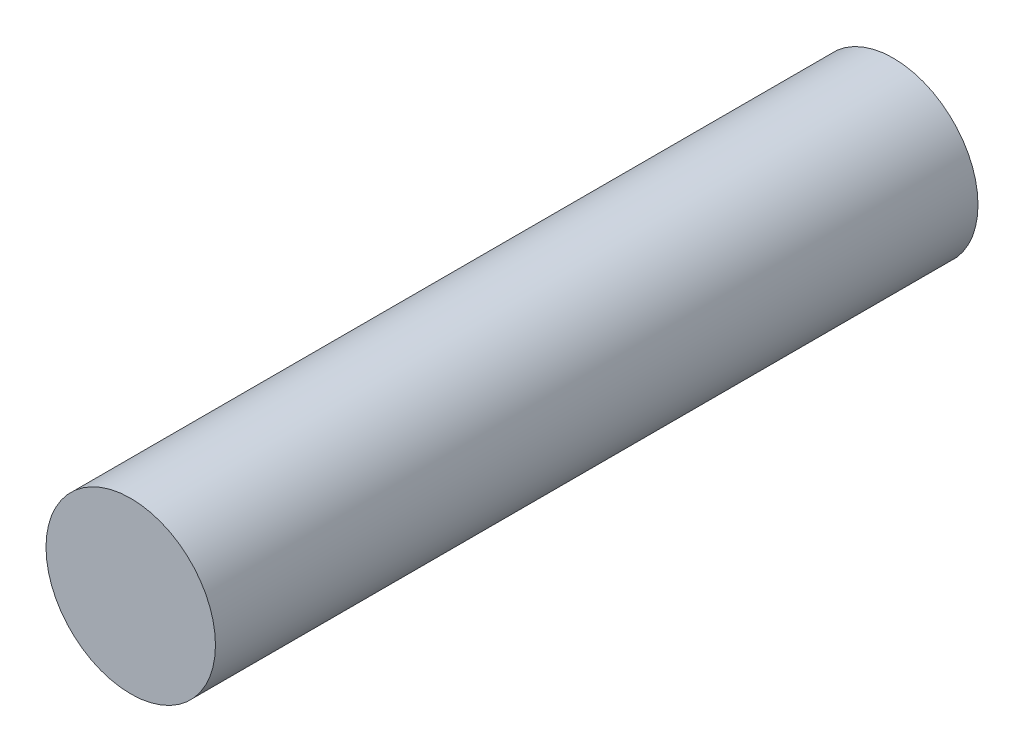
ISO-10303-21;
HEADER;
FILE_DESCRIPTION(('STEP AP214'),'2;1');
FILE_NAME('part.step','',(''),(''),'','','');
FILE_SCHEMA(('AUTOMOTIVE_DESIGN { 1 0 10303 214 1 1 1 1 }'));
ENDSEC;
DATA;
#1=APPLICATION_CONTEXT('core data for automotive mechanical design processes');
#2=APPLICATION_PROTOCOL_DEFINITION('international standard','automotive_design',2000,#1);
#3=PRODUCT_CONTEXT('',#1,'mechanical');
#4=PRODUCT('Part','Part','',(#3));
#5=PRODUCT_RELATED_PRODUCT_CATEGORY('part','',(#4));
#6=PRODUCT_DEFINITION_FORMATION('','',#4);
#7=PRODUCT_DEFINITION_CONTEXT('part definition',#1,'design');
#8=PRODUCT_DEFINITION('design','',#6,#7);
#9=PRODUCT_DEFINITION_SHAPE('','',#8);
#10=(LENGTH_UNIT() NAMED_UNIT(*) SI_UNIT(.MILLI.,.METRE.));
#11=(NAMED_UNIT(*) PLANE_ANGLE_UNIT() SI_UNIT($,.RADIAN.));
#12=(NAMED_UNIT(*) SI_UNIT($,.STERADIAN.) SOLID_ANGLE_UNIT());
#13=UNCERTAINTY_MEASURE_WITH_UNIT(LENGTH_MEASURE(1.E-05),#10,'distance_accuracy_value','');
#14=(GEOMETRIC_REPRESENTATION_CONTEXT(3) GLOBAL_UNCERTAINTY_ASSIGNED_CONTEXT((#13)) GLOBAL_UNIT_ASSIGNED_CONTEXT((#10,
#11,#12)) REPRESENTATION_CONTEXT('',''));
#15=CARTESIAN_POINT('',(0.,0.,0.));
#16=DIRECTION('',(0.,0.,1.));
#17=DIRECTION('',(1.,0.,0.));
#18=AXIS2_PLACEMENT_3D('',#15,#16,#17);
#19=CARTESIAN_POINT('',(0.,0.,114.3));
#20=DIRECTION('',(0.,0.,-1.));
#21=DIRECTION('',(-1.,0.,0.));
#22=AXIS2_PLACEMENT_3D('',#19,#20,#21);
#23=CYLINDRICAL_SURFACE('',#22,12.7);
#24=CARTESIAN_POINT('',(0.,0.,114.3));
#25=DIRECTION('',(0.,0.,1.));
#26=DIRECTION('',(1.,0.,0.));
#27=AXIS2_PLACEMENT_3D('',#24,#25,#26);
#28=CIRCLE('',#27,12.7);
#29=CARTESIAN_POINT('',(12.7,0.,114.3));
#30=VERTEX_POINT('',#29);
#31=EDGE_CURVE('E10',#30,#30,#28,.T.);
#32=ORIENTED_EDGE('',*,*,#31,.F.);
#33=EDGE_LOOP('',(#32));
#34=FACE_BOUND('',#33,.T.);
#35=CARTESIAN_POINT('',(0.,0.,0.));
#36=DIRECTION('',(0.,0.,1.));
#37=DIRECTION('',(1.,0.,0.));
#38=AXIS2_PLACEMENT_3D('',#35,#36,#37);
#39=CIRCLE('',#38,12.7);
#40=CARTESIAN_POINT('',(12.7,0.,0.));
#41=VERTEX_POINT('',#40);
#42=EDGE_CURVE('E34',#41,#41,#39,.T.);
#43=ORIENTED_EDGE('',*,*,#42,.T.);
#44=EDGE_LOOP('',(#43));
#45=FACE_BOUND('',#44,.T.);
#46=ADVANCED_FACE('F31',(#34,#45),#23,.T.);
#47=CARTESIAN_POINT('',(0.,0.,114.3));
#48=DIRECTION('',(0.,0.,1.));
#49=DIRECTION('',(1.,0.,0.));
#50=AXIS2_PLACEMENT_3D('',#47,#48,#49);
#51=PLANE('',#50);
#52=ORIENTED_EDGE('',*,*,#31,.T.);
#53=EDGE_LOOP('',(#52));
#54=FACE_BOUND('',#53,.T.);
#55=ADVANCED_FACE('F46',(#54),#51,.T.);
#56=CARTESIAN_POINT('',(0.,0.,0.));
#57=DIRECTION('',(0.,0.,1.));
#58=DIRECTION('',(1.,0.,0.));
#59=AXIS2_PLACEMENT_3D('',#56,#57,#58);
#60=PLANE('',#59);
#61=ORIENTED_EDGE('',*,*,#42,.F.);
#62=EDGE_LOOP('',(#61));
#63=FACE_BOUND('',#62,.T.);
#64=ADVANCED_FACE('F44',(#63),#60,.F.);
#65=CLOSED_SHELL('',(#46,#55,#64));
#66=MANIFOLD_SOLID_BREP('B2',#65);
#67=ADVANCED_BREP_SHAPE_REPRESENTATION('',(#18,#66),#14);
#68=SHAPE_DEFINITION_REPRESENTATION(#9,#67);
ENDSEC;
END-ISO-10303-21;
